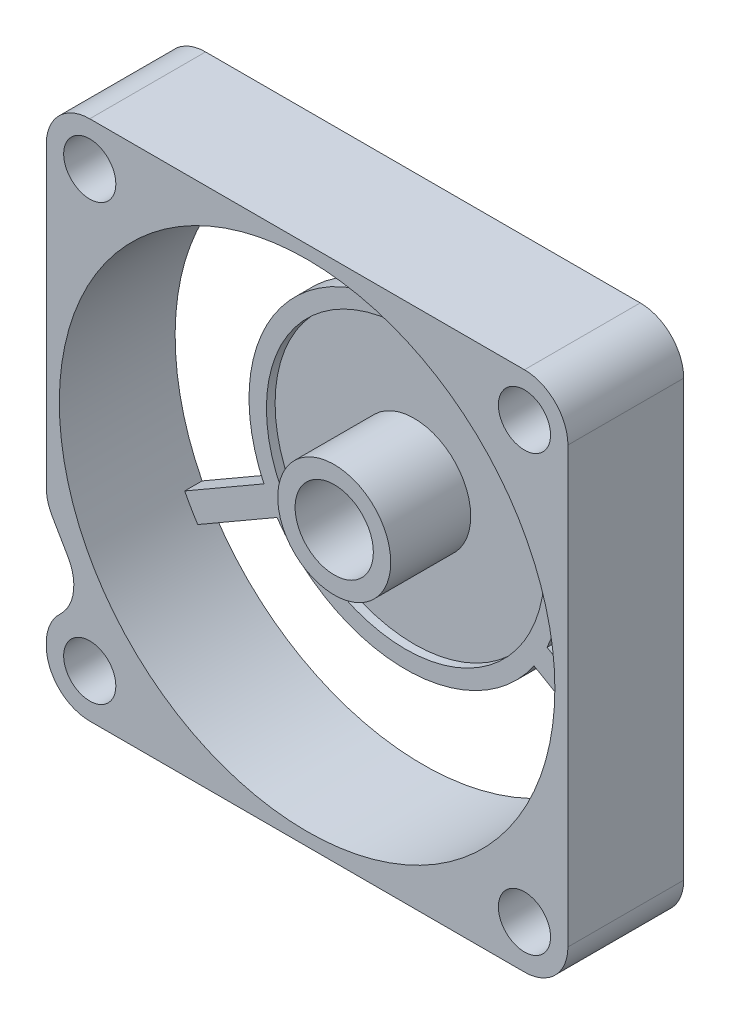
ISO-10303-21;
HEADER;
FILE_DESCRIPTION(('STEP AP214'),'2;1');
FILE_NAME('part.step','',(''),(''),'','','');
FILE_SCHEMA(('AUTOMOTIVE_DESIGN { 1 0 10303 214 1 1 1 1 }'));
ENDSEC;
DATA;
#1=APPLICATION_CONTEXT('core data for automotive mechanical design processes');
#2=APPLICATION_PROTOCOL_DEFINITION('international standard','automotive_design',2000,#1);
#3=PRODUCT_CONTEXT('',#1,'mechanical');
#4=PRODUCT('Part','Part','',(#3));
#5=PRODUCT_RELATED_PRODUCT_CATEGORY('part','',(#4));
#6=PRODUCT_DEFINITION_FORMATION('','',#4);
#7=PRODUCT_DEFINITION_CONTEXT('part definition',#1,'design');
#8=PRODUCT_DEFINITION('design','',#6,#7);
#9=PRODUCT_DEFINITION_SHAPE('','',#8);
#10=(LENGTH_UNIT() NAMED_UNIT(*) SI_UNIT(.MILLI.,.METRE.));
#11=(NAMED_UNIT(*) PLANE_ANGLE_UNIT() SI_UNIT($,.RADIAN.));
#12=(NAMED_UNIT(*) SI_UNIT($,.STERADIAN.) SOLID_ANGLE_UNIT());
#13=UNCERTAINTY_MEASURE_WITH_UNIT(LENGTH_MEASURE(1.E-05),#10,'distance_accuracy_value','');
#14=(GEOMETRIC_REPRESENTATION_CONTEXT(3) GLOBAL_UNCERTAINTY_ASSIGNED_CONTEXT((#13)) GLOBAL_UNIT_ASSIGNED_CONTEXT((#10,
#11,#12)) REPRESENTATION_CONTEXT('',''));
#15=CARTESIAN_POINT('',(0.,0.,0.));
#16=DIRECTION('',(0.,0.,1.));
#17=DIRECTION('',(1.,0.,0.));
#18=AXIS2_PLACEMENT_3D('',#15,#16,#17);
#19=CARTESIAN_POINT('',(0.,0.,1.));
#20=DIRECTION('',(0.,0.,-1.));
#21=DIRECTION('',(-1.,0.,0.));
#22=AXIS2_PLACEMENT_3D('',#19,#20,#21);
#23=PLANE('',#22);
#24=CARTESIAN_POINT('',(0.,0.,1.));
#25=DIRECTION('',(0.,0.,1.));
#26=DIRECTION('',(1.,0.,0.));
#27=AXIS2_PLACEMENT_3D('',#24,#25,#26);
#28=CIRCLE('',#27,8.);
#29=CARTESIAN_POINT('',(8.,0.,1.));
#30=VERTEX_POINT('',#29);
#31=EDGE_CURVE('E459',#30,#30,#28,.T.);
#32=ORIENTED_EDGE('',*,*,#31,.F.);
#33=EDGE_LOOP('',(#32));
#34=FACE_BOUND('',#33,.T.);
#35=DIRECTION('',(0.,1.,0.));
#36=VECTOR('',#35,1.);
#37=CARTESIAN_POINT('',(0.749999999999998,14.2302494707577,1.));
#38=LINE('',#37,#36);
#39=CARTESIAN_POINT('',(0.750000000000002,8.96869555732605,1.));
#40=VERTEX_POINT('',#39);
#41=CARTESIAN_POINT('',(0.749999999999998,14.2302494707577,1.));
#42=VERTEX_POINT('',#41);
#43=EDGE_CURVE('E243',#40,#42,#38,.T.);
#44=ORIENTED_EDGE('',*,*,#43,.T.);
#45=CARTESIAN_POINT('',(0.,0.,1.));
#46=DIRECTION('',(0.,0.,1.));
#47=DIRECTION('',(-1.,0.,0.));
#48=AXIS2_PLACEMENT_3D('',#45,#46,#47);
#49=CIRCLE('',#48,14.25);
#50=CARTESIAN_POINT('',(-0.749999999999998,14.2302494707577,1.));
#51=VERTEX_POINT('',#50);
#52=EDGE_CURVE('E260',#42,#51,#49,.T.);
#53=ORIENTED_EDGE('',*,*,#52,.T.);
#54=DIRECTION('',(0.,-1.,0.));
#55=VECTOR('',#54,1.);
#56=CARTESIAN_POINT('',(-0.75,8.96869555732605,1.));
#57=LINE('',#56,#55);
#58=CARTESIAN_POINT('',(-0.75,8.96869555732605,1.));
#59=VERTEX_POINT('',#58);
#60=EDGE_CURVE('E262',#51,#59,#57,.T.);
#61=ORIENTED_EDGE('',*,*,#60,.T.);
#62=CARTESIAN_POINT('',(0.,0.,1.));
#63=DIRECTION('',(0.,0.,1.));
#64=DIRECTION('',(-1.,0.,0.));
#65=AXIS2_PLACEMENT_3D('',#62,#63,#64);
#66=CIRCLE('',#65,9.);
#67=CARTESIAN_POINT('',(-8.14211819145298,-3.83482872582473,1.));
#68=VERTEX_POINT('',#67);
#69=EDGE_CURVE('E265',#59,#68,#66,.T.);
#70=ORIENTED_EDGE('',*,*,#69,.T.);
#71=DIRECTION('',(-0.866025403784436,-0.500000000000004,0.));
#72=VECTOR('',#71,1.);
#73=CARTESIAN_POINT('',(-12.6987575438662,-6.46560568254059,1.));
#74=LINE('',#73,#72);
#75=CARTESIAN_POINT('',(-12.6987575438662,-6.46560568254059,1.));
#76=VERTEX_POINT('',#75);
#77=EDGE_CURVE('E206',#68,#76,#74,.T.);
#78=ORIENTED_EDGE('',*,*,#77,.T.);
#79=CARTESIAN_POINT('',(0.,0.,1.));
#80=DIRECTION('',(0.,0.,1.));
#81=DIRECTION('',(-1.,0.,0.));
#82=AXIS2_PLACEMENT_3D('',#79,#80,#81);
#83=CIRCLE('',#82,14.25);
#84=CARTESIAN_POINT('',(-11.9487575438663,-7.76464378821707,1.));
#85=VERTEX_POINT('',#84);
#86=EDGE_CURVE('E200',#76,#85,#83,.T.);
#87=ORIENTED_EDGE('',*,*,#86,.T.);
#88=DIRECTION('',(0.866025403784443,0.499999999999992,0.));
#89=VECTOR('',#88,1.);
#90=CARTESIAN_POINT('',(-7.39211819145304,-5.13386683150128,1.));
#91=LINE('',#90,#89);
#92=CARTESIAN_POINT('',(-7.39211819145304,-5.13386683150128,1.));
#93=VERTEX_POINT('',#92);
#94=EDGE_CURVE('E203',#85,#93,#91,.T.);
#95=ORIENTED_EDGE('',*,*,#94,.T.);
#96=CARTESIAN_POINT('',(0.,0.,1.));
#97=DIRECTION('',(0.,0.,1.));
#98=DIRECTION('',(0.499999999999992,-0.866025403784443,0.));
#99=AXIS2_PLACEMENT_3D('',#96,#97,#98);
#100=CIRCLE('',#99,9.);
#101=CARTESIAN_POINT('',(7.39211819145297,-5.13386683150139,1.));
#102=VERTEX_POINT('',#101);
#103=EDGE_CURVE('E220',#93,#102,#100,.T.);
#104=ORIENTED_EDGE('',*,*,#103,.T.);
#105=DIRECTION('',(0.866025403784437,-0.500000000000004,0.));
#106=VECTOR('',#105,1.);
#107=CARTESIAN_POINT('',(11.9487575438662,-7.76464378821724,1.));
#108=LINE('',#107,#106);
#109=CARTESIAN_POINT('',(11.9487575438662,-7.76464378821724,1.));
#110=VERTEX_POINT('',#109);
#111=EDGE_CURVE('E476',#102,#110,#108,.T.);
#112=ORIENTED_EDGE('',*,*,#111,.T.);
#113=CARTESIAN_POINT('',(0.,0.,1.));
#114=DIRECTION('',(0.,0.,1.));
#115=DIRECTION('',(0.500000000000004,0.866025403784436,0.));
#116=AXIS2_PLACEMENT_3D('',#113,#114,#115);
#117=CIRCLE('',#116,14.25);
#118=CARTESIAN_POINT('',(12.6987575438662,-6.46560568254058,1.));
#119=VERTEX_POINT('',#118);
#120=EDGE_CURVE('E236',#110,#119,#117,.T.);
#121=ORIENTED_EDGE('',*,*,#120,.T.);
#122=DIRECTION('',(-0.866025403784436,0.500000000000004,0.));
#123=VECTOR('',#122,1.);
#124=CARTESIAN_POINT('',(8.14211819145298,-3.83482872582473,1.));
#125=LINE('',#124,#123);
#126=CARTESIAN_POINT('',(8.14211819145298,-3.83482872582473,1.));
#127=VERTEX_POINT('',#126);
#128=EDGE_CURVE('E238',#119,#127,#125,.T.);
#129=ORIENTED_EDGE('',*,*,#128,.T.);
#130=CARTESIAN_POINT('',(0.,0.,1.));
#131=DIRECTION('',(0.,0.,1.));
#132=DIRECTION('',(0.500000000000004,0.866025403784436,0.));
#133=AXIS2_PLACEMENT_3D('',#130,#131,#132);
#134=CIRCLE('',#133,9.);
#135=EDGE_CURVE('E241',#127,#40,#134,.T.);
#136=ORIENTED_EDGE('',*,*,#135,.T.);
#137=EDGE_LOOP('',(#44,#53,#61,#70,#78,#87,#95,#104,#112,#121,#129,#136));
#138=FACE_BOUND('',#137,.T.);
#139=ADVANCED_FACE('F33',(#34,#138),#23,.F.);
#140=CARTESIAN_POINT('',(0.,0.,6.66));
#141=DIRECTION('',(0.,0.,-1.));
#142=DIRECTION('',(-1.,0.,0.));
#143=AXIS2_PLACEMENT_3D('',#140,#141,#142);
#144=CYLINDRICAL_SURFACE('',#143,14.25);
#145=CARTESIAN_POINT('',(0.,0.,6.66));
#146=DIRECTION('',(0.,0.,1.));
#147=DIRECTION('',(1.,0.,0.));
#148=AXIS2_PLACEMENT_3D('',#145,#146,#147);
#149=CIRCLE('',#148,14.25);
#150=CARTESIAN_POINT('',(14.25,0.,6.66));
#151=VERTEX_POINT('',#150);
#152=EDGE_CURVE('E307',#151,#151,#149,.T.);
#153=ORIENTED_EDGE('',*,*,#152,.T.);
#154=EDGE_LOOP('',(#153));
#155=FACE_BOUND('',#154,.T.);
#156=ORIENTED_EDGE('',*,*,#52,.F.);
#157=DIRECTION('',(0.,0.,-1.));
#158=VECTOR('',#157,1.);
#159=CARTESIAN_POINT('',(0.749999999999998,14.2302494707577,1.));
#160=LINE('',#159,#158);
#161=CARTESIAN_POINT('',(0.749999999999998,14.2302494707577,0.));
#162=VERTEX_POINT('',#161);
#163=EDGE_CURVE('E244',#42,#162,#160,.T.);
#164=ORIENTED_EDGE('',*,*,#163,.T.);
#165=CARTESIAN_POINT('',(0.,0.,0.));
#166=DIRECTION('',(0.,0.,1.));
#167=DIRECTION('',(1.,0.,0.));
#168=AXIS2_PLACEMENT_3D('',#165,#166,#167);
#169=CIRCLE('',#168,14.25);
#170=CARTESIAN_POINT('',(12.6987575438662,-6.46560568254058,0.));
#171=VERTEX_POINT('',#170);
#172=EDGE_CURVE('E304',#171,#162,#169,.T.);
#173=ORIENTED_EDGE('',*,*,#172,.F.);
#174=DIRECTION('',(0.,0.,-1.));
#175=VECTOR('',#174,1.);
#176=CARTESIAN_POINT('',(12.6987575438662,-6.46560568254058,1.));
#177=LINE('',#176,#175);
#178=EDGE_CURVE('E256',#119,#171,#177,.T.);
#179=ORIENTED_EDGE('',*,*,#178,.F.);
#180=ORIENTED_EDGE('',*,*,#120,.F.);
#181=DIRECTION('',(0.,0.,-1.));
#182=VECTOR('',#181,1.);
#183=CARTESIAN_POINT('',(11.9487575438662,-7.76464378821724,1.));
#184=LINE('',#183,#182);
#185=CARTESIAN_POINT('',(11.9487575438662,-7.76464378821724,0.));
#186=VERTEX_POINT('',#185);
#187=EDGE_CURVE('E478',#110,#186,#184,.T.);
#188=ORIENTED_EDGE('',*,*,#187,.T.);
#189=CARTESIAN_POINT('',(-11.9487575438663,-7.76464378821707,0.));
#190=VERTEX_POINT('',#189);
#191=EDGE_CURVE('E227',#190,#186,#169,.T.);
#192=ORIENTED_EDGE('',*,*,#191,.F.);
#193=DIRECTION('',(0.,0.,-1.));
#194=VECTOR('',#193,1.);
#195=CARTESIAN_POINT('',(-11.9487575438663,-7.76464378821707,1.));
#196=LINE('',#195,#194);
#197=EDGE_CURVE('E215',#85,#190,#196,.T.);
#198=ORIENTED_EDGE('',*,*,#197,.F.);
#199=ORIENTED_EDGE('',*,*,#86,.F.);
#200=DIRECTION('',(0.,0.,-1.));
#201=VECTOR('',#200,1.);
#202=CARTESIAN_POINT('',(-12.6987575438662,-6.46560568254059,1.));
#203=LINE('',#202,#201);
#204=CARTESIAN_POINT('',(-12.6987575438662,-6.46560568254059,0.));
#205=VERTEX_POINT('',#204);
#206=EDGE_CURVE('E211',#76,#205,#203,.T.);
#207=ORIENTED_EDGE('',*,*,#206,.T.);
#208=CARTESIAN_POINT('',(-0.75,14.2302494707577,0.));
#209=VERTEX_POINT('',#208);
#210=EDGE_CURVE('E311',#209,#205,#169,.T.);
#211=ORIENTED_EDGE('',*,*,#210,.F.);
#212=DIRECTION('',(0.,0.,-1.));
#213=VECTOR('',#212,1.);
#214=CARTESIAN_POINT('',(-0.749999999999998,14.2302494707577,1.));
#215=LINE('',#214,#213);
#216=EDGE_CURVE('E279',#51,#209,#215,.T.);
#217=ORIENTED_EDGE('',*,*,#216,.F.);
#218=EDGE_LOOP('',(#156,#164,#173,#179,#180,#188,#192,#198,#199,#207,#211,#217));
#219=FACE_BOUND('',#218,.T.);
#220=ADVANCED_FACE('F224',(#155,#219),#144,.F.);
#221=CARTESIAN_POINT('',(0.,0.,6.66));
#222=DIRECTION('',(0.,0.,1.));
#223=DIRECTION('',(1.,0.,0.));
#224=AXIS2_PLACEMENT_3D('',#221,#222,#223);
#225=PLANE('',#224);
#226=CARTESIAN_POINT('',(-15.9150635094611,-8.69818514459075,6.66));
#227=DIRECTION('',(0.,0.,1.));
#228=DIRECTION('',(1.,0.,0.));
#229=AXIS2_PLACEMENT_3D('',#226,#227,#228);
#230=CIRCLE('',#229,2.5);
#231=CARTESIAN_POINT('',(-13.75,-7.44818514459076,6.66));
#232=VERTEX_POINT('',#231);
#233=CARTESIAN_POINT('',(-14.2075317547305,-10.5242013840002,6.66));
#234=VERTEX_POINT('',#233);
#235=EDGE_CURVE('E380',#232,#234,#230,.F.);
#236=ORIENTED_EDGE('',*,*,#235,.T.);
#237=CARTESIAN_POINT('',(-12.5,-12.3502176234096,6.66));
#238=DIRECTION('',(0.,0.,1.));
#239=DIRECTION('',(1.,0.,0.));
#240=AXIS2_PLACEMENT_3D('',#237,#238,#239);
#241=CIRCLE('',#240,2.5);
#242=CARTESIAN_POINT('',(-15.,-12.3502176234096,6.66));
#243=VERTEX_POINT('',#242);
#244=EDGE_CURVE('E388',#234,#243,#241,.T.);
#245=ORIENTED_EDGE('',*,*,#244,.T.);
#246=DIRECTION('',(0.,-1.,0.));
#247=VECTOR('',#246,1.);
#248=CARTESIAN_POINT('',(-15.,15.,6.66));
#249=LINE('',#248,#247);
#250=CARTESIAN_POINT('',(-15.,-12.5,6.66));
#251=VERTEX_POINT('',#250);
#252=EDGE_CURVE('E321',#243,#251,#249,.T.);
#253=ORIENTED_EDGE('',*,*,#252,.T.);
#254=CARTESIAN_POINT('',(-12.5,-12.5,6.66));
#255=DIRECTION('',(0.,0.,1.));
#256=DIRECTION('',(1.,0.,0.));
#257=AXIS2_PLACEMENT_3D('',#254,#255,#256);
#258=CIRCLE('',#257,2.5);
#259=CARTESIAN_POINT('',(-12.5,-15.,6.66));
#260=VERTEX_POINT('',#259);
#261=EDGE_CURVE('E360',#251,#260,#258,.T.);
#262=ORIENTED_EDGE('',*,*,#261,.T.);
#263=DIRECTION('',(1.,0.,0.));
#264=VECTOR('',#263,1.);
#265=CARTESIAN_POINT('',(-15.,-15.,6.66));
#266=LINE('',#265,#264);
#267=CARTESIAN_POINT('',(12.5,-15.,6.66));
#268=VERTEX_POINT('',#267);
#269=EDGE_CURVE('E325',#260,#268,#266,.T.);
#270=ORIENTED_EDGE('',*,*,#269,.T.);
#271=CARTESIAN_POINT('',(12.5,-12.5,6.66));
#272=DIRECTION('',(0.,0.,1.));
#273=DIRECTION('',(1.,0.,0.));
#274=AXIS2_PLACEMENT_3D('',#271,#272,#273);
#275=CIRCLE('',#274,2.5);
#276=CARTESIAN_POINT('',(15.,-12.5,6.66));
#277=VERTEX_POINT('',#276);
#278=EDGE_CURVE('E362',#268,#277,#275,.T.);
#279=ORIENTED_EDGE('',*,*,#278,.T.);
#280=DIRECTION('',(0.,1.,0.));
#281=VECTOR('',#280,1.);
#282=CARTESIAN_POINT('',(15.,15.,6.66));
#283=LINE('',#282,#281);
#284=CARTESIAN_POINT('',(15.,12.5,6.66));
#285=VERTEX_POINT('',#284);
#286=EDGE_CURVE('E314',#277,#285,#283,.T.);
#287=ORIENTED_EDGE('',*,*,#286,.T.);
#288=CARTESIAN_POINT('',(12.5,12.5,6.66));
#289=DIRECTION('',(0.,0.,1.));
#290=DIRECTION('',(1.,0.,0.));
#291=AXIS2_PLACEMENT_3D('',#288,#289,#290);
#292=CIRCLE('',#291,2.5);
#293=CARTESIAN_POINT('',(12.5,15.,6.66));
#294=VERTEX_POINT('',#293);
#295=EDGE_CURVE('E358',#285,#294,#292,.T.);
#296=ORIENTED_EDGE('',*,*,#295,.T.);
#297=DIRECTION('',(-1.,0.,0.));
#298=VECTOR('',#297,1.);
#299=CARTESIAN_POINT('',(-15.,15.,6.66));
#300=LINE('',#299,#298);
#301=CARTESIAN_POINT('',(-12.5,15.,6.66));
#302=VERTEX_POINT('',#301);
#303=EDGE_CURVE('E317',#294,#302,#300,.T.);
#304=ORIENTED_EDGE('',*,*,#303,.T.);
#305=CARTESIAN_POINT('',(-12.5,12.5,6.66));
#306=DIRECTION('',(0.,0.,1.));
#307=DIRECTION('',(1.,0.,0.));
#308=AXIS2_PLACEMENT_3D('',#305,#306,#307);
#309=CIRCLE('',#308,2.5);
#310=CARTESIAN_POINT('',(-15.,12.5,6.66));
#311=VERTEX_POINT('',#310);
#312=EDGE_CURVE('E356',#302,#311,#309,.T.);
#313=ORIENTED_EDGE('',*,*,#312,.T.);
#314=CARTESIAN_POINT('',(-15.,-4.6132486540518,6.66));
#315=VERTEX_POINT('',#314);
#316=EDGE_CURVE('E322',#311,#315,#249,.T.);
#317=ORIENTED_EDGE('',*,*,#316,.T.);
#318=CARTESIAN_POINT('',(-12.5,-4.6132486540518,6.66));
#319=DIRECTION('',(0.,0.,1.));
#320=DIRECTION('',(1.,0.,0.));
#321=AXIS2_PLACEMENT_3D('',#318,#319,#320);
#322=CIRCLE('',#321,2.5);
#323=CARTESIAN_POINT('',(-14.6650635094611,-5.86324865405179,6.66));
#324=VERTEX_POINT('',#323);
#325=EDGE_CURVE('E386',#315,#324,#322,.T.);
#326=ORIENTED_EDGE('',*,*,#325,.T.);
#327=DIRECTION('',(-0.499999999999995,0.866025403784441,0.));
#328=VECTOR('',#327,1.);
#329=CARTESIAN_POINT('',(-15.,-5.28312163512959,6.66));
#330=LINE('',#329,#328);
#331=EDGE_CURVE('E449',#232,#324,#330,.T.);
#332=ORIENTED_EDGE('',*,*,#331,.F.);
#333=EDGE_LOOP('',(#236,#245,#253,#262,#270,#279,#287,#296,#304,#313,#317,#326,#332));
#334=FACE_BOUND('',#333,.T.);
#335=CARTESIAN_POINT('',(12.5,-12.5,6.66));
#336=DIRECTION('',(0.,0.,1.));
#337=DIRECTION('',(1.,0.,0.));
#338=AXIS2_PLACEMENT_3D('',#335,#336,#337);
#339=CIRCLE('',#338,1.5);
#340=CARTESIAN_POINT('',(14.,-12.5,6.66));
#341=VERTEX_POINT('',#340);
#342=EDGE_CURVE('E289',#341,#341,#339,.T.);
#343=ORIENTED_EDGE('',*,*,#342,.F.);
#344=EDGE_LOOP('',(#343));
#345=FACE_BOUND('',#344,.T.);
#346=CARTESIAN_POINT('',(-12.5,12.5,6.66));
#347=DIRECTION('',(0.,0.,1.));
#348=DIRECTION('',(1.,0.,0.));
#349=AXIS2_PLACEMENT_3D('',#346,#347,#348);
#350=CIRCLE('',#349,1.5);
#351=CARTESIAN_POINT('',(-11.,12.5,6.66));
#352=VERTEX_POINT('',#351);
#353=EDGE_CURVE('E301',#352,#352,#350,.T.);
#354=ORIENTED_EDGE('',*,*,#353,.F.);
#355=EDGE_LOOP('',(#354));
#356=FACE_BOUND('',#355,.T.);
#357=ORIENTED_EDGE('',*,*,#152,.F.);
#358=EDGE_LOOP('',(#357));
#359=FACE_BOUND('',#358,.T.);
#360=CARTESIAN_POINT('',(12.5,12.5,6.66));
#361=DIRECTION('',(0.,0.,1.));
#362=DIRECTION('',(1.,0.,0.));
#363=AXIS2_PLACEMENT_3D('',#360,#361,#362);
#364=CIRCLE('',#363,1.5);
#365=CARTESIAN_POINT('',(14.,12.5,6.66));
#366=VERTEX_POINT('',#365);
#367=EDGE_CURVE('E295',#366,#366,#364,.T.);
#368=ORIENTED_EDGE('',*,*,#367,.F.);
#369=EDGE_LOOP('',(#368));
#370=FACE_BOUND('',#369,.T.);
#371=CARTESIAN_POINT('',(-12.5,-12.5,6.66));
#372=DIRECTION('',(0.,0.,1.));
#373=DIRECTION('',(1.,0.,0.));
#374=AXIS2_PLACEMENT_3D('',#371,#372,#373);
#375=CIRCLE('',#374,1.5);
#376=CARTESIAN_POINT('',(-11.,-12.5,6.66));
#377=VERTEX_POINT('',#376);
#378=EDGE_CURVE('E283',#377,#377,#375,.T.);
#379=ORIENTED_EDGE('',*,*,#378,.F.);
#380=EDGE_LOOP('',(#379));
#381=FACE_BOUND('',#380,.T.);
#382=ADVANCED_FACE('F407',(#334,#345,#356,#359,#370,#381),#225,.T.);
#383=CARTESIAN_POINT('',(0.,0.,0.));
#384=DIRECTION('',(0.,0.,1.));
#385=DIRECTION('',(1.,0.,0.));
#386=AXIS2_PLACEMENT_3D('',#383,#384,#385);
#387=PLANE('',#386);
#388=CARTESIAN_POINT('',(0.,0.,0.));
#389=DIRECTION('',(0.,0.,1.));
#390=DIRECTION('',(1.,0.,0.));
#391=AXIS2_PLACEMENT_3D('',#388,#389,#390);
#392=CIRCLE('',#391,2.25);
#393=CARTESIAN_POINT('',(2.25,0.,0.));
#394=VERTEX_POINT('',#393);
#395=EDGE_CURVE('E471',#394,#394,#392,.T.);
#396=ORIENTED_EDGE('',*,*,#395,.T.);
#397=EDGE_LOOP('',(#396));
#398=FACE_BOUND('',#397,.T.);
#399=DIRECTION('',(-0.866025403784436,0.500000000000004,0.));
#400=VECTOR('',#399,1.);
#401=CARTESIAN_POINT('',(8.14211819145298,-3.83482872582473,0.));
#402=LINE('',#401,#400);
#403=CARTESIAN_POINT('',(8.14211819145298,-3.83482872582473,0.));
#404=VERTEX_POINT('',#403);
#405=EDGE_CURVE('E228',#171,#404,#402,.T.);
#406=ORIENTED_EDGE('',*,*,#405,.F.);
#407=ORIENTED_EDGE('',*,*,#172,.T.);
#408=DIRECTION('',(0.,1.,0.));
#409=VECTOR('',#408,1.);
#410=CARTESIAN_POINT('',(0.749999999999998,14.2302494707577,0.));
#411=LINE('',#410,#409);
#412=CARTESIAN_POINT('',(0.750000000000002,8.96869555732605,0.));
#413=VERTEX_POINT('',#412);
#414=EDGE_CURVE('E239',#413,#162,#411,.T.);
#415=ORIENTED_EDGE('',*,*,#414,.F.);
#416=CARTESIAN_POINT('',(0.,0.,0.));
#417=DIRECTION('',(0.,0.,1.));
#418=DIRECTION('',(0.500000000000004,0.866025403784436,0.));
#419=AXIS2_PLACEMENT_3D('',#416,#417,#418);
#420=CIRCLE('',#419,9.);
#421=EDGE_CURVE('E230',#404,#413,#420,.T.);
#422=ORIENTED_EDGE('',*,*,#421,.F.);
#423=EDGE_LOOP('',(#406,#407,#415,#422));
#424=FACE_BOUND('',#423,.T.);
#425=DIRECTION('',(0.866025403784443,0.499999999999992,0.));
#426=VECTOR('',#425,1.);
#427=CARTESIAN_POINT('',(-7.39211819145304,-5.13386683150128,0.));
#428=LINE('',#427,#426);
#429=CARTESIAN_POINT('',(-7.39211819145304,-5.13386683150128,0.));
#430=VERTEX_POINT('',#429);
#431=EDGE_CURVE('E473',#190,#430,#428,.T.);
#432=ORIENTED_EDGE('',*,*,#431,.F.);
#433=ORIENTED_EDGE('',*,*,#191,.T.);
#434=DIRECTION('',(0.866025403784437,-0.500000000000004,0.));
#435=VECTOR('',#434,1.);
#436=CARTESIAN_POINT('',(11.9487575438662,-7.76464378821724,0.));
#437=LINE('',#436,#435);
#438=CARTESIAN_POINT('',(7.39211819145297,-5.13386683150139,0.));
#439=VERTEX_POINT('',#438);
#440=EDGE_CURVE('E221',#439,#186,#437,.T.);
#441=ORIENTED_EDGE('',*,*,#440,.F.);
#442=CARTESIAN_POINT('',(0.,0.,0.));
#443=DIRECTION('',(0.,0.,1.));
#444=DIRECTION('',(0.499999999999992,-0.866025403784443,0.));
#445=AXIS2_PLACEMENT_3D('',#442,#443,#444);
#446=CIRCLE('',#445,9.);
#447=EDGE_CURVE('E480',#430,#439,#446,.T.);
#448=ORIENTED_EDGE('',*,*,#447,.F.);
#449=EDGE_LOOP('',(#432,#433,#441,#448));
#450=FACE_BOUND('',#449,.T.);
#451=DIRECTION('',(0.,-1.,0.));
#452=VECTOR('',#451,1.);
#453=CARTESIAN_POINT('',(-0.75,8.96869555732605,0.));
#454=LINE('',#453,#452);
#455=CARTESIAN_POINT('',(-0.75,8.96869555732605,0.));
#456=VERTEX_POINT('',#455);
#457=EDGE_CURVE('E259',#209,#456,#454,.T.);
#458=ORIENTED_EDGE('',*,*,#457,.F.);
#459=ORIENTED_EDGE('',*,*,#210,.T.);
#460=DIRECTION('',(-0.866025403784436,-0.500000000000004,0.));
#461=VECTOR('',#460,1.);
#462=CARTESIAN_POINT('',(-12.6987575438662,-6.46560568254059,0.));
#463=LINE('',#462,#461);
#464=CARTESIAN_POINT('',(-8.14211819145298,-3.83482872582473,0.));
#465=VERTEX_POINT('',#464);
#466=EDGE_CURVE('E263',#465,#205,#463,.T.);
#467=ORIENTED_EDGE('',*,*,#466,.F.);
#468=CARTESIAN_POINT('',(0.,0.,0.));
#469=DIRECTION('',(0.,0.,1.));
#470=DIRECTION('',(-1.,0.,0.));
#471=AXIS2_PLACEMENT_3D('',#468,#469,#470);
#472=CIRCLE('',#471,9.);
#473=EDGE_CURVE('E269',#456,#465,#472,.T.);
#474=ORIENTED_EDGE('',*,*,#473,.F.);
#475=EDGE_LOOP('',(#458,#459,#467,#474));
#476=FACE_BOUND('',#475,.T.);
#477=DIRECTION('',(0.,1.,0.));
#478=VECTOR('',#477,1.);
#479=CARTESIAN_POINT('',(15.,15.,0.));
#480=LINE('',#479,#478);
#481=CARTESIAN_POINT('',(15.,-12.5,0.));
#482=VERTEX_POINT('',#481);
#483=CARTESIAN_POINT('',(15.,12.5,0.));
#484=VERTEX_POINT('',#483);
#485=EDGE_CURVE('E310',#482,#484,#480,.T.);
#486=ORIENTED_EDGE('',*,*,#485,.F.);
#487=CARTESIAN_POINT('',(12.5,-12.5,0.));
#488=DIRECTION('',(0.,0.,1.));
#489=DIRECTION('',(1.,0.,0.));
#490=AXIS2_PLACEMENT_3D('',#487,#488,#489);
#491=CIRCLE('',#490,2.5);
#492=CARTESIAN_POINT('',(12.5,-15.,0.));
#493=VERTEX_POINT('',#492);
#494=EDGE_CURVE('E349',#482,#493,#491,.F.);
#495=ORIENTED_EDGE('',*,*,#494,.T.);
#496=DIRECTION('',(1.,0.,0.));
#497=VECTOR('',#496,1.);
#498=CARTESIAN_POINT('',(-15.,-15.,0.));
#499=LINE('',#498,#497);
#500=CARTESIAN_POINT('',(-12.5,-15.,0.));
#501=VERTEX_POINT('',#500);
#502=EDGE_CURVE('E318',#501,#493,#499,.T.);
#503=ORIENTED_EDGE('',*,*,#502,.F.);
#504=CARTESIAN_POINT('',(-12.5,-12.5,0.));
#505=DIRECTION('',(0.,0.,1.));
#506=DIRECTION('',(1.,0.,0.));
#507=AXIS2_PLACEMENT_3D('',#504,#505,#506);
#508=CIRCLE('',#507,2.5);
#509=CARTESIAN_POINT('',(-15.,-12.5,0.));
#510=VERTEX_POINT('',#509);
#511=EDGE_CURVE('E347',#501,#510,#508,.F.);
#512=ORIENTED_EDGE('',*,*,#511,.T.);
#513=DIRECTION('',(0.,-1.,0.));
#514=VECTOR('',#513,1.);
#515=CARTESIAN_POINT('',(-15.,15.,0.));
#516=LINE('',#515,#514);
#517=CARTESIAN_POINT('',(-15.,12.5,0.));
#518=VERTEX_POINT('',#517);
#519=EDGE_CURVE('E334',#518,#510,#516,.T.);
#520=ORIENTED_EDGE('',*,*,#519,.F.);
#521=CARTESIAN_POINT('',(-12.5,12.5,0.));
#522=DIRECTION('',(0.,0.,1.));
#523=DIRECTION('',(1.,0.,0.));
#524=AXIS2_PLACEMENT_3D('',#521,#522,#523);
#525=CIRCLE('',#524,2.5);
#526=CARTESIAN_POINT('',(-12.5,15.,0.));
#527=VERTEX_POINT('',#526);
#528=EDGE_CURVE('E343',#518,#527,#525,.F.);
#529=ORIENTED_EDGE('',*,*,#528,.T.);
#530=DIRECTION('',(-1.,0.,0.));
#531=VECTOR('',#530,1.);
#532=CARTESIAN_POINT('',(-15.,15.,0.));
#533=LINE('',#532,#531);
#534=CARTESIAN_POINT('',(12.5,15.,0.));
#535=VERTEX_POINT('',#534);
#536=EDGE_CURVE('E331',#535,#527,#533,.T.);
#537=ORIENTED_EDGE('',*,*,#536,.F.);
#538=CARTESIAN_POINT('',(12.5,12.5,0.));
#539=DIRECTION('',(0.,0.,1.));
#540=DIRECTION('',(1.,0.,0.));
#541=AXIS2_PLACEMENT_3D('',#538,#539,#540);
#542=CIRCLE('',#541,2.5);
#543=EDGE_CURVE('E345',#535,#484,#542,.F.);
#544=ORIENTED_EDGE('',*,*,#543,.T.);
#545=EDGE_LOOP('',(#486,#495,#503,#512,#520,#529,#537,#544));
#546=FACE_BOUND('',#545,.T.);
#547=CARTESIAN_POINT('',(-12.5,12.5,0.));
#548=DIRECTION('',(0.,0.,1.));
#549=DIRECTION('',(1.,0.,0.));
#550=AXIS2_PLACEMENT_3D('',#547,#548,#549);
#551=CIRCLE('',#550,1.5);
#552=CARTESIAN_POINT('',(-11.,12.5,0.));
#553=VERTEX_POINT('',#552);
#554=EDGE_CURVE('E298',#553,#553,#551,.T.);
#555=ORIENTED_EDGE('',*,*,#554,.T.);
#556=EDGE_LOOP('',(#555));
#557=FACE_BOUND('',#556,.T.);
#558=CARTESIAN_POINT('',(12.5,12.5,0.));
#559=DIRECTION('',(0.,0.,1.));
#560=DIRECTION('',(1.,0.,0.));
#561=AXIS2_PLACEMENT_3D('',#558,#559,#560);
#562=CIRCLE('',#561,1.5);
#563=CARTESIAN_POINT('',(14.,12.5,0.));
#564=VERTEX_POINT('',#563);
#565=EDGE_CURVE('E292',#564,#564,#562,.T.);
#566=ORIENTED_EDGE('',*,*,#565,.T.);
#567=EDGE_LOOP('',(#566));
#568=FACE_BOUND('',#567,.T.);
#569=CARTESIAN_POINT('',(12.5,-12.5,0.));
#570=DIRECTION('',(0.,0.,1.));
#571=DIRECTION('',(1.,0.,0.));
#572=AXIS2_PLACEMENT_3D('',#569,#570,#571);
#573=CIRCLE('',#572,1.5);
#574=CARTESIAN_POINT('',(14.,-12.5,0.));
#575=VERTEX_POINT('',#574);
#576=EDGE_CURVE('E286',#575,#575,#573,.T.);
#577=ORIENTED_EDGE('',*,*,#576,.T.);
#578=EDGE_LOOP('',(#577));
#579=FACE_BOUND('',#578,.T.);
#580=CARTESIAN_POINT('',(-12.5,-12.5,0.));
#581=DIRECTION('',(0.,0.,1.));
#582=DIRECTION('',(1.,0.,0.));
#583=AXIS2_PLACEMENT_3D('',#580,#581,#582);
#584=CIRCLE('',#583,1.5);
#585=CARTESIAN_POINT('',(-11.,-12.5,0.));
#586=VERTEX_POINT('',#585);
#587=EDGE_CURVE('E282',#586,#586,#584,.T.);
#588=ORIENTED_EDGE('',*,*,#587,.T.);
#589=EDGE_LOOP('',(#588));
#590=FACE_BOUND('',#589,.T.);
#591=ADVANCED_FACE('F493',(#398,#424,#450,#476,#546,#557,#568,#579,#590),#387,.F.);
#592=CARTESIAN_POINT('',(15.,15.,6.66));
#593=DIRECTION('',(-1.,0.,0.));
#594=DIRECTION('',(0.,0.,1.));
#595=AXIS2_PLACEMENT_3D('',#592,#593,#594);
#596=PLANE('',#595);
#597=ORIENTED_EDGE('',*,*,#286,.F.);
#598=DIRECTION('',(0.,0.,-1.));
#599=VECTOR('',#598,1.);
#600=CARTESIAN_POINT('',(15.,-12.5,6.66));
#601=LINE('',#600,#599);
#602=EDGE_CURVE('E340',#277,#482,#601,.T.);
#603=ORIENTED_EDGE('',*,*,#602,.T.);
#604=ORIENTED_EDGE('',*,*,#485,.T.);
#605=DIRECTION('',(0.,0.,-1.));
#606=VECTOR('',#605,1.);
#607=CARTESIAN_POINT('',(15.,12.5,6.66));
#608=LINE('',#607,#606);
#609=EDGE_CURVE('E328',#484,#285,#608,.F.);
#610=ORIENTED_EDGE('',*,*,#609,.T.);
#611=EDGE_LOOP('',(#597,#603,#604,#610));
#612=FACE_BOUND('',#611,.T.);
#613=ADVANCED_FACE('F430',(#612),#596,.F.);
#614=CARTESIAN_POINT('',(-15.,15.,6.66));
#615=DIRECTION('',(0.,-1.,0.));
#616=DIRECTION('',(0.,0.,-1.));
#617=AXIS2_PLACEMENT_3D('',#614,#615,#616);
#618=PLANE('',#617);
#619=ORIENTED_EDGE('',*,*,#303,.F.);
#620=DIRECTION('',(0.,0.,-1.));
#621=VECTOR('',#620,1.);
#622=CARTESIAN_POINT('',(12.5,15.,6.66));
#623=LINE('',#622,#621);
#624=EDGE_CURVE('E372',#294,#535,#623,.T.);
#625=ORIENTED_EDGE('',*,*,#624,.T.);
#626=ORIENTED_EDGE('',*,*,#536,.T.);
#627=DIRECTION('',(0.,0.,-1.));
#628=VECTOR('',#627,1.);
#629=CARTESIAN_POINT('',(-12.5,15.,6.66));
#630=LINE('',#629,#628);
#631=EDGE_CURVE('E370',#527,#302,#630,.F.);
#632=ORIENTED_EDGE('',*,*,#631,.T.);
#633=EDGE_LOOP('',(#619,#625,#626,#632));
#634=FACE_BOUND('',#633,.T.);
#635=ADVANCED_FACE('F439',(#634),#618,.F.);
#636=CARTESIAN_POINT('',(-15.,15.,6.66));
#637=DIRECTION('',(1.,0.,0.));
#638=DIRECTION('',(0.,1.,0.));
#639=AXIS2_PLACEMENT_3D('',#636,#637,#638);
#640=PLANE('',#639);
#641=ORIENTED_EDGE('',*,*,#252,.F.);
#642=DIRECTION('',(0.,0.,-1.));
#643=VECTOR('',#642,1.);
#644=CARTESIAN_POINT('',(-15.,-12.3502176234096,6.66));
#645=LINE('',#644,#643);
#646=CARTESIAN_POINT('',(-15.,-12.3502176234096,1.));
#647=VERTEX_POINT('',#646);
#648=EDGE_CURVE('E393',#243,#647,#645,.T.);
#649=ORIENTED_EDGE('',*,*,#648,.T.);
#650=DIRECTION('',(0.,-1.,0.));
#651=VECTOR('',#650,1.);
#652=CARTESIAN_POINT('',(-15.,-11.0566243270259,1.));
#653=LINE('',#652,#651);
#654=CARTESIAN_POINT('',(-15.,-4.6132486540518,1.));
#655=VERTEX_POINT('',#654);
#656=EDGE_CURVE('E55',#655,#647,#653,.T.);
#657=ORIENTED_EDGE('',*,*,#656,.F.);
#658=DIRECTION('',(0.,0.,1.));
#659=VECTOR('',#658,1.);
#660=CARTESIAN_POINT('',(-15.,-4.6132486540518,6.66));
#661=LINE('',#660,#659);
#662=EDGE_CURVE('E390',#655,#315,#661,.T.);
#663=ORIENTED_EDGE('',*,*,#662,.T.);
#664=ORIENTED_EDGE('',*,*,#316,.F.);
#665=DIRECTION('',(0.,0.,-1.));
#666=VECTOR('',#665,1.);
#667=CARTESIAN_POINT('',(-15.,12.5,6.66));
#668=LINE('',#667,#666);
#669=EDGE_CURVE('E364',#311,#518,#668,.T.);
#670=ORIENTED_EDGE('',*,*,#669,.T.);
#671=ORIENTED_EDGE('',*,*,#519,.T.);
#672=DIRECTION('',(0.,0.,-1.));
#673=VECTOR('',#672,1.);
#674=CARTESIAN_POINT('',(-15.,-12.5,6.66));
#675=LINE('',#674,#673);
#676=EDGE_CURVE('E367',#510,#251,#675,.F.);
#677=ORIENTED_EDGE('',*,*,#676,.T.);
#678=EDGE_LOOP('',(#641,#649,#657,#663,#664,#670,#671,#677));
#679=FACE_BOUND('',#678,.T.);
#680=ADVANCED_FACE('F411',(#679),#640,.F.);
#681=CARTESIAN_POINT('',(-15.,-15.,6.66));
#682=DIRECTION('',(0.,1.,0.));
#683=DIRECTION('',(0.,0.,1.));
#684=AXIS2_PLACEMENT_3D('',#681,#682,#683);
#685=PLANE('',#684);
#686=ORIENTED_EDGE('',*,*,#502,.T.);
#687=DIRECTION('',(0.,0.,-1.));
#688=VECTOR('',#687,1.);
#689=CARTESIAN_POINT('',(12.5,-15.,6.66));
#690=LINE('',#689,#688);
#691=EDGE_CURVE('E354',#493,#268,#690,.F.);
#692=ORIENTED_EDGE('',*,*,#691,.T.);
#693=ORIENTED_EDGE('',*,*,#269,.F.);
#694=DIRECTION('',(0.,0.,-1.));
#695=VECTOR('',#694,1.);
#696=CARTESIAN_POINT('',(-12.5,-15.,6.66));
#697=LINE('',#696,#695);
#698=EDGE_CURVE('E351',#260,#501,#697,.T.);
#699=ORIENTED_EDGE('',*,*,#698,.T.);
#700=EDGE_LOOP('',(#686,#692,#693,#699));
#701=FACE_BOUND('',#700,.T.);
#702=ADVANCED_FACE('F421',(#701),#685,.F.);
#703=CARTESIAN_POINT('',(-12.5,12.5,6.66));
#704=DIRECTION('',(0.,0.,-1.));
#705=DIRECTION('',(-1.,0.,0.));
#706=AXIS2_PLACEMENT_3D('',#703,#704,#705);
#707=CYLINDRICAL_SURFACE('',#706,1.5);
#708=ORIENTED_EDGE('',*,*,#353,.T.);
#709=EDGE_LOOP('',(#708));
#710=FACE_BOUND('',#709,.T.);
#711=ORIENTED_EDGE('',*,*,#554,.F.);
#712=EDGE_LOOP('',(#711));
#713=FACE_BOUND('',#712,.T.);
#714=ADVANCED_FACE('F564',(#710,#713),#707,.F.);
#715=CARTESIAN_POINT('',(12.5,12.5,6.66));
#716=DIRECTION('',(0.,0.,-1.));
#717=DIRECTION('',(-1.,0.,0.));
#718=AXIS2_PLACEMENT_3D('',#715,#716,#717);
#719=CYLINDRICAL_SURFACE('',#718,1.5);
#720=ORIENTED_EDGE('',*,*,#367,.T.);
#721=EDGE_LOOP('',(#720));
#722=FACE_BOUND('',#721,.T.);
#723=ORIENTED_EDGE('',*,*,#565,.F.);
#724=EDGE_LOOP('',(#723));
#725=FACE_BOUND('',#724,.T.);
#726=ADVANCED_FACE('F560',(#722,#725),#719,.F.);
#727=CARTESIAN_POINT('',(12.5,-12.5,6.66));
#728=DIRECTION('',(0.,0.,-1.));
#729=DIRECTION('',(-1.,0.,0.));
#730=AXIS2_PLACEMENT_3D('',#727,#728,#729);
#731=CYLINDRICAL_SURFACE('',#730,1.5);
#732=ORIENTED_EDGE('',*,*,#342,.T.);
#733=EDGE_LOOP('',(#732));
#734=FACE_BOUND('',#733,.T.);
#735=ORIENTED_EDGE('',*,*,#576,.F.);
#736=EDGE_LOOP('',(#735));
#737=FACE_BOUND('',#736,.T.);
#738=ADVANCED_FACE('F556',(#734,#737),#731,.F.);
#739=CARTESIAN_POINT('',(-12.5,-12.5,6.66));
#740=DIRECTION('',(0.,0.,-1.));
#741=DIRECTION('',(-1.,0.,0.));
#742=AXIS2_PLACEMENT_3D('',#739,#740,#741);
#743=CYLINDRICAL_SURFACE('',#742,1.5);
#744=ORIENTED_EDGE('',*,*,#378,.T.);
#745=EDGE_LOOP('',(#744));
#746=FACE_BOUND('',#745,.T.);
#747=ORIENTED_EDGE('',*,*,#587,.F.);
#748=EDGE_LOOP('',(#747));
#749=FACE_BOUND('',#748,.T.);
#750=ADVANCED_FACE('F553',(#746,#749),#743,.F.);
#751=CARTESIAN_POINT('',(-0.75,8.96869555732605,1.));
#752=DIRECTION('',(1.,0.,0.));
#753=DIRECTION('',(0.,0.,-1.));
#754=AXIS2_PLACEMENT_3D('',#751,#752,#753);
#755=PLANE('',#754);
#756=ORIENTED_EDGE('',*,*,#457,.T.);
#757=DIRECTION('',(0.,0.,-1.));
#758=VECTOR('',#757,1.);
#759=CARTESIAN_POINT('',(-0.75,8.96869555732605,1.));
#760=LINE('',#759,#758);
#761=EDGE_CURVE('E276',#59,#456,#760,.T.);
#762=ORIENTED_EDGE('',*,*,#761,.F.);
#763=ORIENTED_EDGE('',*,*,#60,.F.);
#764=ORIENTED_EDGE('',*,*,#216,.T.);
#765=EDGE_LOOP('',(#756,#762,#763,#764));
#766=FACE_BOUND('',#765,.T.);
#767=ADVANCED_FACE('F510',(#766),#755,.F.);
#768=CARTESIAN_POINT('',(0.,0.,1.));
#769=DIRECTION('',(0.,0.,-1.));
#770=DIRECTION('',(-1.,0.,0.));
#771=AXIS2_PLACEMENT_3D('',#768,#769,#770);
#772=CYLINDRICAL_SURFACE('',#771,9.);
#773=ORIENTED_EDGE('',*,*,#473,.T.);
#774=DIRECTION('',(0.,0.,-1.));
#775=VECTOR('',#774,1.);
#776=CARTESIAN_POINT('',(-8.14211819145298,-3.83482872582473,1.));
#777=LINE('',#776,#775);
#778=EDGE_CURVE('E273',#68,#465,#777,.T.);
#779=ORIENTED_EDGE('',*,*,#778,.F.);
#780=ORIENTED_EDGE('',*,*,#69,.F.);
#781=ORIENTED_EDGE('',*,*,#761,.T.);
#782=EDGE_LOOP('',(#773,#779,#780,#781));
#783=FACE_BOUND('',#782,.T.);
#784=ADVANCED_FACE('F506',(#783),#772,.T.);
#785=CARTESIAN_POINT('',(-12.6987575438662,-6.46560568254059,1.));
#786=DIRECTION('',(0.500000000000004,-0.866025403784436,0.));
#787=DIRECTION('',(0.866025403784436,0.500000000000004,0.));
#788=AXIS2_PLACEMENT_3D('',#785,#786,#787);
#789=PLANE('',#788);
#790=ORIENTED_EDGE('',*,*,#466,.T.);
#791=ORIENTED_EDGE('',*,*,#206,.F.);
#792=ORIENTED_EDGE('',*,*,#77,.F.);
#793=ORIENTED_EDGE('',*,*,#778,.T.);
#794=EDGE_LOOP('',(#790,#791,#792,#793));
#795=FACE_BOUND('',#794,.T.);
#796=ADVANCED_FACE('F502',(#795),#789,.F.);
#797=CARTESIAN_POINT('',(8.14211819145298,-3.83482872582473,1.));
#798=DIRECTION('',(-0.500000000000004,-0.866025403784436,0.));
#799=DIRECTION('',(0.866025403784436,-0.500000000000004,0.));
#800=AXIS2_PLACEMENT_3D('',#797,#798,#799);
#801=PLANE('',#800);
#802=ORIENTED_EDGE('',*,*,#405,.T.);
#803=DIRECTION('',(0.,0.,-1.));
#804=VECTOR('',#803,1.);
#805=CARTESIAN_POINT('',(8.14211819145298,-3.83482872582473,1.));
#806=LINE('',#805,#804);
#807=EDGE_CURVE('E253',#127,#404,#806,.T.);
#808=ORIENTED_EDGE('',*,*,#807,.F.);
#809=ORIENTED_EDGE('',*,*,#128,.F.);
#810=ORIENTED_EDGE('',*,*,#178,.T.);
#811=EDGE_LOOP('',(#802,#808,#809,#810));
#812=FACE_BOUND('',#811,.T.);
#813=ADVANCED_FACE('F522',(#812),#801,.F.);
#814=CARTESIAN_POINT('',(0.,0.,1.));
#815=DIRECTION('',(0.,0.,-1.));
#816=DIRECTION('',(-1.,0.,0.));
#817=AXIS2_PLACEMENT_3D('',#814,#815,#816);
#818=CYLINDRICAL_SURFACE('',#817,9.);
#819=ORIENTED_EDGE('',*,*,#421,.T.);
#820=DIRECTION('',(0.,0.,-1.));
#821=VECTOR('',#820,1.);
#822=CARTESIAN_POINT('',(0.750000000000002,8.96869555732605,1.));
#823=LINE('',#822,#821);
#824=EDGE_CURVE('E250',#40,#413,#823,.T.);
#825=ORIENTED_EDGE('',*,*,#824,.F.);
#826=ORIENTED_EDGE('',*,*,#135,.F.);
#827=ORIENTED_EDGE('',*,*,#807,.T.);
#828=EDGE_LOOP('',(#819,#825,#826,#827));
#829=FACE_BOUND('',#828,.T.);
#830=ADVANCED_FACE('F769',(#829),#818,.T.);
#831=CARTESIAN_POINT('',(0.749999999999998,14.2302494707577,1.));
#832=DIRECTION('',(-1.,0.,0.));
#833=DIRECTION('',(0.,-1.,0.));
#834=AXIS2_PLACEMENT_3D('',#831,#832,#833);
#835=PLANE('',#834);
#836=ORIENTED_EDGE('',*,*,#414,.T.);
#837=ORIENTED_EDGE('',*,*,#163,.F.);
#838=ORIENTED_EDGE('',*,*,#43,.F.);
#839=ORIENTED_EDGE('',*,*,#824,.T.);
#840=EDGE_LOOP('',(#836,#837,#838,#839));
#841=FACE_BOUND('',#840,.T.);
#842=ADVANCED_FACE('F533',(#841),#835,.F.);
#843=CARTESIAN_POINT('',(-7.39211819145304,-5.13386683150128,1.));
#844=DIRECTION('',(-0.499999999999992,0.866025403784443,0.));
#845=DIRECTION('',(-0.866025403784443,-0.499999999999992,0.));
#846=AXIS2_PLACEMENT_3D('',#843,#844,#845);
#847=PLANE('',#846);
#848=ORIENTED_EDGE('',*,*,#431,.T.);
#849=DIRECTION('',(0.,0.,-1.));
#850=VECTOR('',#849,1.);
#851=CARTESIAN_POINT('',(-7.39211819145304,-5.13386683150128,1.));
#852=LINE('',#851,#850);
#853=EDGE_CURVE('E218',#93,#430,#852,.T.);
#854=ORIENTED_EDGE('',*,*,#853,.F.);
#855=ORIENTED_EDGE('',*,*,#94,.F.);
#856=ORIENTED_EDGE('',*,*,#197,.T.);
#857=EDGE_LOOP('',(#848,#854,#855,#856));
#858=FACE_BOUND('',#857,.T.);
#859=ADVANCED_FACE('F214',(#858),#847,.F.);
#860=CARTESIAN_POINT('',(0.,0.,1.));
#861=DIRECTION('',(0.,0.,-1.));
#862=DIRECTION('',(-1.,0.,0.));
#863=AXIS2_PLACEMENT_3D('',#860,#861,#862);
#864=CYLINDRICAL_SURFACE('',#863,9.);
#865=ORIENTED_EDGE('',*,*,#447,.T.);
#866=DIRECTION('',(0.,0.,-1.));
#867=VECTOR('',#866,1.);
#868=CARTESIAN_POINT('',(7.39211819145297,-5.13386683150139,1.));
#869=LINE('',#868,#867);
#870=EDGE_CURVE('E232',#102,#439,#869,.T.);
#871=ORIENTED_EDGE('',*,*,#870,.F.);
#872=ORIENTED_EDGE('',*,*,#103,.F.);
#873=ORIENTED_EDGE('',*,*,#853,.T.);
#874=EDGE_LOOP('',(#865,#871,#872,#873));
#875=FACE_BOUND('',#874,.T.);
#876=ADVANCED_FACE('F524',(#875),#864,.T.);
#877=CARTESIAN_POINT('',(11.9487575438662,-7.76464378821724,1.));
#878=DIRECTION('',(0.500000000000004,0.866025403784437,0.));
#879=DIRECTION('',(-0.866025403784437,0.500000000000004,0.));
#880=AXIS2_PLACEMENT_3D('',#877,#878,#879);
#881=PLANE('',#880);
#882=ORIENTED_EDGE('',*,*,#440,.T.);
#883=ORIENTED_EDGE('',*,*,#187,.F.);
#884=ORIENTED_EDGE('',*,*,#111,.F.);
#885=ORIENTED_EDGE('',*,*,#870,.T.);
#886=EDGE_LOOP('',(#882,#883,#884,#885));
#887=FACE_BOUND('',#886,.T.);
#888=ADVANCED_FACE('F488',(#887),#881,.F.);
#889=CARTESIAN_POINT('',(0.,0.,6.66));
#890=DIRECTION('',(0.,0.,-1.));
#891=DIRECTION('',(-1.,0.,0.));
#892=AXIS2_PLACEMENT_3D('',#889,#890,#891);
#893=CYLINDRICAL_SURFACE('',#892,2.25);
#894=ORIENTED_EDGE('',*,*,#395,.F.);
#895=EDGE_LOOP('',(#894));
#896=FACE_BOUND('',#895,.T.);
#897=CARTESIAN_POINT('',(0.,0.,5.1));
#898=DIRECTION('',(0.,0.,1.));
#899=DIRECTION('',(1.,0.,0.));
#900=AXIS2_PLACEMENT_3D('',#897,#898,#899);
#901=CIRCLE('',#900,2.25);
#902=CARTESIAN_POINT('',(2.25,0.,5.1));
#903=VERTEX_POINT('',#902);
#904=EDGE_CURVE('E463',#903,#903,#901,.T.);
#905=ORIENTED_EDGE('',*,*,#904,.T.);
#906=EDGE_LOOP('',(#905));
#907=FACE_BOUND('',#906,.T.);
#908=ADVANCED_FACE('F531',(#896,#907),#893,.F.);
#909=CARTESIAN_POINT('',(0.,0.,5.1));
#910=DIRECTION('',(0.,0.,1.));
#911=DIRECTION('',(1.,0.,0.));
#912=AXIS2_PLACEMENT_3D('',#909,#910,#911);
#913=PLANE('',#912);
#914=CARTESIAN_POINT('',(0.,0.,5.1));
#915=DIRECTION('',(0.,0.,1.));
#916=DIRECTION('',(1.,0.,0.));
#917=AXIS2_PLACEMENT_3D('',#914,#915,#916);
#918=CIRCLE('',#917,3.25);
#919=CARTESIAN_POINT('',(3.25,0.,5.1));
#920=VERTEX_POINT('',#919);
#921=EDGE_CURVE('E468',#920,#920,#918,.T.);
#922=ORIENTED_EDGE('',*,*,#921,.T.);
#923=EDGE_LOOP('',(#922));
#924=FACE_BOUND('',#923,.T.);
#925=ORIENTED_EDGE('',*,*,#904,.F.);
#926=EDGE_LOOP('',(#925));
#927=FACE_BOUND('',#926,.T.);
#928=ADVANCED_FACE('F667',(#924,#927),#913,.T.);
#929=CARTESIAN_POINT('',(0.,0.,5.1));
#930=DIRECTION('',(0.,0.,-1.));
#931=DIRECTION('',(-1.,0.,0.));
#932=AXIS2_PLACEMENT_3D('',#929,#930,#931);
#933=CYLINDRICAL_SURFACE('',#932,3.25);
#934=ORIENTED_EDGE('',*,*,#921,.F.);
#935=EDGE_LOOP('',(#934));
#936=FACE_BOUND('',#935,.T.);
#937=CARTESIAN_POINT('',(0.,0.,0.5));
#938=DIRECTION('',(0.,0.,1.));
#939=DIRECTION('',(1.,0.,0.));
#940=AXIS2_PLACEMENT_3D('',#937,#938,#939);
#941=CIRCLE('',#940,3.25);
#942=CARTESIAN_POINT('',(3.25,0.,0.5));
#943=VERTEX_POINT('',#942);
#944=EDGE_CURVE('E455',#943,#943,#941,.T.);
#945=ORIENTED_EDGE('',*,*,#944,.T.);
#946=EDGE_LOOP('',(#945));
#947=FACE_BOUND('',#946,.T.);
#948=ADVANCED_FACE('F584',(#936,#947),#933,.T.);
#949=CARTESIAN_POINT('',(12.5,-12.5,6.66));
#950=DIRECTION('',(0.,0.,-1.));
#951=DIRECTION('',(-1.,0.,0.));
#952=AXIS2_PLACEMENT_3D('',#949,#950,#951);
#953=CYLINDRICAL_SURFACE('',#952,2.5);
#954=ORIENTED_EDGE('',*,*,#278,.F.);
#955=ORIENTED_EDGE('',*,*,#691,.F.);
#956=ORIENTED_EDGE('',*,*,#494,.F.);
#957=ORIENTED_EDGE('',*,*,#602,.F.);
#958=EDGE_LOOP('',(#954,#955,#956,#957));
#959=FACE_BOUND('',#958,.T.);
#960=ADVANCED_FACE('F425',(#959),#953,.T.);
#961=CARTESIAN_POINT('',(-12.5,-12.5,6.66));
#962=DIRECTION('',(0.,0.,-1.));
#963=DIRECTION('',(-1.,0.,0.));
#964=AXIS2_PLACEMENT_3D('',#961,#962,#963);
#965=CYLINDRICAL_SURFACE('',#964,2.5);
#966=ORIENTED_EDGE('',*,*,#261,.F.);
#967=ORIENTED_EDGE('',*,*,#676,.F.);
#968=ORIENTED_EDGE('',*,*,#511,.F.);
#969=ORIENTED_EDGE('',*,*,#698,.F.);
#970=EDGE_LOOP('',(#966,#967,#968,#969));
#971=FACE_BOUND('',#970,.T.);
#972=ADVANCED_FACE('F417',(#971),#965,.T.);
#973=CARTESIAN_POINT('',(12.5,12.5,6.66));
#974=DIRECTION('',(0.,0.,-1.));
#975=DIRECTION('',(-1.,0.,0.));
#976=AXIS2_PLACEMENT_3D('',#973,#974,#975);
#977=CYLINDRICAL_SURFACE('',#976,2.5);
#978=ORIENTED_EDGE('',*,*,#295,.F.);
#979=ORIENTED_EDGE('',*,*,#609,.F.);
#980=ORIENTED_EDGE('',*,*,#543,.F.);
#981=ORIENTED_EDGE('',*,*,#624,.F.);
#982=EDGE_LOOP('',(#978,#979,#980,#981));
#983=FACE_BOUND('',#982,.T.);
#984=ADVANCED_FACE('F434',(#983),#977,.T.);
#985=CARTESIAN_POINT('',(-12.5,12.5,6.66));
#986=DIRECTION('',(0.,0.,-1.));
#987=DIRECTION('',(-1.,0.,0.));
#988=AXIS2_PLACEMENT_3D('',#985,#986,#987);
#989=CYLINDRICAL_SURFACE('',#988,2.5);
#990=ORIENTED_EDGE('',*,*,#312,.F.);
#991=ORIENTED_EDGE('',*,*,#631,.F.);
#992=ORIENTED_EDGE('',*,*,#528,.F.);
#993=ORIENTED_EDGE('',*,*,#669,.F.);
#994=EDGE_LOOP('',(#990,#991,#992,#993));
#995=FACE_BOUND('',#994,.T.);
#996=ADVANCED_FACE('F443',(#995),#989,.T.);
#997=CARTESIAN_POINT('',(0.,0.,0.5));
#998=DIRECTION('',(0.,0.,1.));
#999=DIRECTION('',(1.,0.,0.));
#1000=AXIS2_PLACEMENT_3D('',#997,#998,#999);
#1001=CYLINDRICAL_SURFACE('',#1000,8.);
#1002=CARTESIAN_POINT('',(0.,0.,0.5));
#1003=DIRECTION('',(0.,0.,1.));
#1004=DIRECTION('',(1.,0.,0.));
#1005=AXIS2_PLACEMENT_3D('',#1002,#1003,#1004);
#1006=CIRCLE('',#1005,8.);
#1007=CARTESIAN_POINT('',(8.,0.,0.5));
#1008=VERTEX_POINT('',#1007);
#1009=EDGE_CURVE('E460',#1008,#1008,#1006,.T.);
#1010=ORIENTED_EDGE('',*,*,#1009,.F.);
#1011=EDGE_LOOP('',(#1010));
#1012=FACE_BOUND('',#1011,.T.);
#1013=ORIENTED_EDGE('',*,*,#31,.T.);
#1014=EDGE_LOOP('',(#1013));
#1015=FACE_BOUND('',#1014,.T.);
#1016=ADVANCED_FACE('F591',(#1012,#1015),#1001,.F.);
#1017=CARTESIAN_POINT('',(0.,0.,0.5));
#1018=DIRECTION('',(0.,0.,1.));
#1019=DIRECTION('',(1.,0.,0.));
#1020=AXIS2_PLACEMENT_3D('',#1017,#1018,#1019);
#1021=PLANE('',#1020);
#1022=ORIENTED_EDGE('',*,*,#944,.F.);
#1023=EDGE_LOOP('',(#1022));
#1024=FACE_BOUND('',#1023,.T.);
#1025=ORIENTED_EDGE('',*,*,#1009,.T.);
#1026=EDGE_LOOP('',(#1025));
#1027=FACE_BOUND('',#1026,.T.);
#1028=ADVANCED_FACE('F626',(#1024,#1027),#1021,.T.);
#1029=CARTESIAN_POINT('',(0.,0.,1.));
#1030=DIRECTION('',(0.,0.,-1.));
#1031=DIRECTION('',(-1.,0.,0.));
#1032=AXIS2_PLACEMENT_3D('',#1029,#1030,#1031);
#1033=PLANE('',#1032);
#1034=ORIENTED_EDGE('',*,*,#656,.T.);
#1035=CARTESIAN_POINT('',(-12.5,-12.3502176234096,1.));
#1036=DIRECTION('',(0.,0.,-1.));
#1037=DIRECTION('',(-1.,0.,0.));
#1038=AXIS2_PLACEMENT_3D('',#1035,#1036,#1037);
#1039=CIRCLE('',#1038,2.5);
#1040=CARTESIAN_POINT('',(-14.2075317547305,-10.5242013840002,1.));
#1041=VERTEX_POINT('',#1040);
#1042=EDGE_CURVE('E41',#647,#1041,#1039,.T.);
#1043=ORIENTED_EDGE('',*,*,#1042,.T.);
#1044=CARTESIAN_POINT('',(-15.9150635094611,-8.69818514459075,1.));
#1045=DIRECTION('',(0.,0.,-1.));
#1046=DIRECTION('',(-1.,0.,0.));
#1047=AXIS2_PLACEMENT_3D('',#1044,#1045,#1046);
#1048=CIRCLE('',#1047,2.5);
#1049=CARTESIAN_POINT('',(-13.75,-7.44818514459077,1.));
#1050=VERTEX_POINT('',#1049);
#1051=EDGE_CURVE('E378',#1041,#1050,#1048,.F.);
#1052=ORIENTED_EDGE('',*,*,#1051,.T.);
#1053=DIRECTION('',(-0.499999999999995,0.866025403784441,0.));
#1054=VECTOR('',#1053,1.);
#1055=CARTESIAN_POINT('',(-15.,-5.28312163512959,1.));
#1056=LINE('',#1055,#1054);
#1057=CARTESIAN_POINT('',(-14.6650635094611,-5.86324865405179,1.));
#1058=VERTEX_POINT('',#1057);
#1059=EDGE_CURVE('E451',#1050,#1058,#1056,.T.);
#1060=ORIENTED_EDGE('',*,*,#1059,.T.);
#1061=CARTESIAN_POINT('',(-12.5,-4.6132486540518,1.));
#1062=DIRECTION('',(0.,0.,-1.));
#1063=DIRECTION('',(-1.,0.,0.));
#1064=AXIS2_PLACEMENT_3D('',#1061,#1062,#1063);
#1065=CIRCLE('',#1064,2.5);
#1066=EDGE_CURVE('E11',#1058,#655,#1065,.T.);
#1067=ORIENTED_EDGE('',*,*,#1066,.T.);
#1068=EDGE_LOOP('',(#1034,#1043,#1052,#1060,#1067));
#1069=FACE_BOUND('',#1068,.T.);
#1070=ADVANCED_FACE('F397',(#1069),#1033,.F.);
#1071=CARTESIAN_POINT('',(-15.,-5.28312163512959,-5.29152869605903));
#1072=DIRECTION('',(0.866025403784441,0.499999999999995,0.));
#1073=DIRECTION('',(-0.499999999999995,0.866025403784441,0.));
#1074=AXIS2_PLACEMENT_3D('',#1071,#1072,#1073);
#1075=PLANE('',#1074);
#1076=ORIENTED_EDGE('',*,*,#331,.T.);
#1077=DIRECTION('',(0.,0.,1.));
#1078=VECTOR('',#1077,1.);
#1079=CARTESIAN_POINT('',(-14.6650635094611,-5.86324865405179,-5.29152869605903));
#1080=LINE('',#1079,#1078);
#1081=EDGE_CURVE('E48',#324,#1058,#1080,.F.);
#1082=ORIENTED_EDGE('',*,*,#1081,.T.);
#1083=ORIENTED_EDGE('',*,*,#1059,.F.);
#1084=DIRECTION('',(0.,0.,1.));
#1085=VECTOR('',#1084,1.);
#1086=CARTESIAN_POINT('',(-13.75,-7.44818514459077,6.66));
#1087=LINE('',#1086,#1085);
#1088=EDGE_CURVE('E375',#1050,#232,#1087,.T.);
#1089=ORIENTED_EDGE('',*,*,#1088,.T.);
#1090=EDGE_LOOP('',(#1076,#1082,#1083,#1089));
#1091=FACE_BOUND('',#1090,.T.);
#1092=ADVANCED_FACE('F450',(#1091),#1075,.F.);
#1093=CARTESIAN_POINT('',(-15.9150635094611,-8.69818514459075,-5.29152869605903));
#1094=DIRECTION('',(0.,0.,-1.));
#1095=DIRECTION('',(-1.,0.,0.));
#1096=AXIS2_PLACEMENT_3D('',#1093,#1094,#1095);
#1097=CYLINDRICAL_SURFACE('',#1096,2.5);
#1098=ORIENTED_EDGE('',*,*,#1051,.F.);
#1099=DIRECTION('',(0.,0.,-1.));
#1100=VECTOR('',#1099,1.);
#1101=CARTESIAN_POINT('',(-14.2075317547305,-10.5242013840002,-5.29152869605903));
#1102=LINE('',#1101,#1100);
#1103=EDGE_CURVE('E383',#1041,#234,#1102,.F.);
#1104=ORIENTED_EDGE('',*,*,#1103,.T.);
#1105=ORIENTED_EDGE('',*,*,#235,.F.);
#1106=ORIENTED_EDGE('',*,*,#1088,.F.);
#1107=EDGE_LOOP('',(#1098,#1104,#1105,#1106));
#1108=FACE_BOUND('',#1107,.T.);
#1109=ADVANCED_FACE('F403',(#1108),#1097,.F.);
#1110=CARTESIAN_POINT('',(-12.5,-12.3502176234096,-5.29152869605903));
#1111=DIRECTION('',(0.,0.,-1.));
#1112=DIRECTION('',(-1.,0.,0.));
#1113=AXIS2_PLACEMENT_3D('',#1110,#1111,#1112);
#1114=CYLINDRICAL_SURFACE('',#1113,2.5);
#1115=ORIENTED_EDGE('',*,*,#1042,.F.);
#1116=ORIENTED_EDGE('',*,*,#648,.F.);
#1117=ORIENTED_EDGE('',*,*,#244,.F.);
#1118=ORIENTED_EDGE('',*,*,#1103,.F.);
#1119=EDGE_LOOP('',(#1115,#1116,#1117,#1118));
#1120=FACE_BOUND('',#1119,.T.);
#1121=ADVANCED_FACE('F404',(#1120),#1114,.T.);
#1122=CARTESIAN_POINT('',(-12.5,-4.6132486540518,6.66));
#1123=DIRECTION('',(0.,0.,1.));
#1124=DIRECTION('',(1.,0.,0.));
#1125=AXIS2_PLACEMENT_3D('',#1122,#1123,#1124);
#1126=CYLINDRICAL_SURFACE('',#1125,2.5);
#1127=ORIENTED_EDGE('',*,*,#1066,.F.);
#1128=ORIENTED_EDGE('',*,*,#1081,.F.);
#1129=ORIENTED_EDGE('',*,*,#325,.F.);
#1130=ORIENTED_EDGE('',*,*,#662,.F.);
#1131=EDGE_LOOP('',(#1127,#1128,#1129,#1130));
#1132=FACE_BOUND('',#1131,.T.);
#1133=ADVANCED_FACE('F35',(#1132),#1126,.T.);
#1134=CLOSED_SHELL('',(#139,#220,#382,#591,#613,#635,#680,#702,#714,#726,#738,#750,#767,#784,
#796,#813,#830,#842,#859,#876,#888,#908,#928,#948,#960,#972,#984,#996,#1016,#1028,#1070,#1092,
#1109,#1121,#1133));
#1135=MANIFOLD_SOLID_BREP('B2',#1134);
#1136=ADVANCED_BREP_SHAPE_REPRESENTATION('',(#18,#1135),#14);
#1137=SHAPE_DEFINITION_REPRESENTATION(#9,#1136);
ENDSEC;
END-ISO-10303-21;
